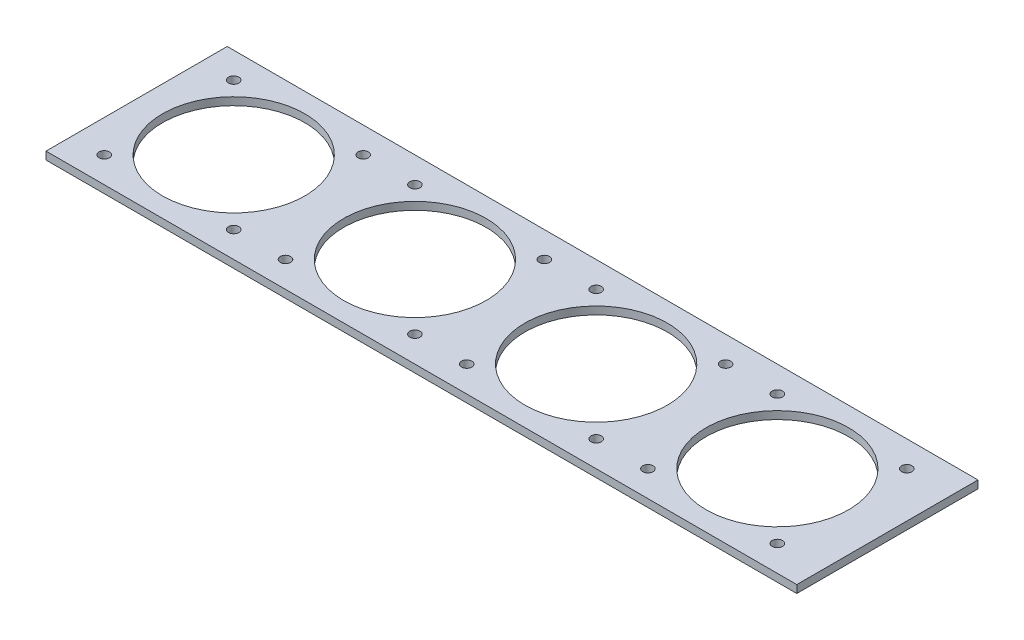
ISO-10303-21;
HEADER;
FILE_DESCRIPTION(('STEP AP214'),'2;1');
FILE_NAME('part.step','',(''),(''),'','','');
FILE_SCHEMA(('AUTOMOTIVE_DESIGN { 1 0 10303 214 1 1 1 1 }'));
ENDSEC;
DATA;
#1=APPLICATION_CONTEXT('core data for automotive mechanical design processes');
#2=APPLICATION_PROTOCOL_DEFINITION('international standard','automotive_design',2000,#1);
#3=PRODUCT_CONTEXT('',#1,'mechanical');
#4=PRODUCT('Part','Part','',(#3));
#5=PRODUCT_RELATED_PRODUCT_CATEGORY('part','',(#4));
#6=PRODUCT_DEFINITION_FORMATION('','',#4);
#7=PRODUCT_DEFINITION_CONTEXT('part definition',#1,'design');
#8=PRODUCT_DEFINITION('design','',#6,#7);
#9=PRODUCT_DEFINITION_SHAPE('','',#8);
#10=(LENGTH_UNIT() NAMED_UNIT(*) SI_UNIT(.MILLI.,.METRE.));
#11=(NAMED_UNIT(*) PLANE_ANGLE_UNIT() SI_UNIT($,.RADIAN.));
#12=(NAMED_UNIT(*) SI_UNIT($,.STERADIAN.) SOLID_ANGLE_UNIT());
#13=UNCERTAINTY_MEASURE_WITH_UNIT(LENGTH_MEASURE(1.E-05),#10,'distance_accuracy_value','');
#14=(GEOMETRIC_REPRESENTATION_CONTEXT(3) GLOBAL_UNCERTAINTY_ASSIGNED_CONTEXT((#13)) GLOBAL_UNIT_ASSIGNED_CONTEXT((#10,
#11,#12)) REPRESENTATION_CONTEXT('',''));
#15=CARTESIAN_POINT('',(0.,0.,0.));
#16=DIRECTION('',(0.,0.,1.));
#17=DIRECTION('',(1.,0.,0.));
#18=AXIS2_PLACEMENT_3D('',#15,#16,#17);
#19=CARTESIAN_POINT('',(0.,3.,0.));
#20=DIRECTION('',(0.,-1.,0.));
#21=DIRECTION('',(0.,0.,-1.));
#22=AXIS2_PLACEMENT_3D('',#19,#20,#21);
#23=PLANE('',#22);
#24=DIRECTION('',(0.,0.,1.));
#25=VECTOR('',#24,1.);
#26=CARTESIAN_POINT('',(0.,3.,0.));
#27=LINE('',#26,#25);
#28=CARTESIAN_POINT('',(0.,3.,-70.));
#29=VERTEX_POINT('',#28);
#30=CARTESIAN_POINT('',(0.,3.,0.));
#31=VERTEX_POINT('',#30);
#32=EDGE_CURVE('E87',#29,#31,#27,.T.);
#33=ORIENTED_EDGE('',*,*,#32,.T.);
#34=DIRECTION('',(1.,0.,0.));
#35=VECTOR('',#34,1.);
#36=CARTESIAN_POINT('',(0.,3.,0.));
#37=LINE('',#36,#35);
#38=CARTESIAN_POINT('',(290.,3.,0.));
#39=VERTEX_POINT('',#38);
#40=EDGE_CURVE('E82',#31,#39,#37,.T.);
#41=ORIENTED_EDGE('',*,*,#40,.T.);
#42=DIRECTION('',(0.,0.,-1.));
#43=VECTOR('',#42,1.);
#44=CARTESIAN_POINT('',(290.,3.,0.));
#45=LINE('',#44,#43);
#46=CARTESIAN_POINT('',(290.,3.,-70.));
#47=VERTEX_POINT('',#46);
#48=EDGE_CURVE('E85',#39,#47,#45,.T.);
#49=ORIENTED_EDGE('',*,*,#48,.T.);
#50=DIRECTION('',(-1.,0.,0.));
#51=VECTOR('',#50,1.);
#52=CARTESIAN_POINT('',(0.,3.,-70.));
#53=LINE('',#52,#51);
#54=EDGE_CURVE('E52',#47,#29,#53,.T.);
#55=ORIENTED_EDGE('',*,*,#54,.T.);
#56=EDGE_LOOP('',(#33,#41,#49,#55));
#57=FACE_BOUND('',#56,.T.);
#58=CARTESIAN_POINT('',(37.5,3.,-35.));
#59=DIRECTION('',(0.,1.,0.));
#60=DIRECTION('',(0.,0.,1.));
#61=AXIS2_PLACEMENT_3D('',#58,#59,#60);
#62=CIRCLE('',#61,27.5);
#63=CARTESIAN_POINT('',(37.5,3.,-7.5));
#64=VERTEX_POINT('',#63);
#65=EDGE_CURVE('E102',#64,#64,#62,.T.);
#66=ORIENTED_EDGE('',*,*,#65,.F.);
#67=EDGE_LOOP('',(#66));
#68=FACE_BOUND('',#67,.T.);
#69=CARTESIAN_POINT('',(12.5,3.,-60.));
#70=DIRECTION('',(0.,1.,0.));
#71=DIRECTION('',(0.,0.,1.));
#72=AXIS2_PLACEMENT_3D('',#69,#70,#71);
#73=CIRCLE('',#72,2.);
#74=CARTESIAN_POINT('',(12.5,3.,-58.));
#75=VERTEX_POINT('',#74);
#76=EDGE_CURVE('E117',#75,#75,#73,.T.);
#77=ORIENTED_EDGE('',*,*,#76,.F.);
#78=EDGE_LOOP('',(#77));
#79=FACE_BOUND('',#78,.T.);
#80=CARTESIAN_POINT('',(62.5,3.,-60.));
#81=DIRECTION('',(0.,1.,0.));
#82=DIRECTION('',(0.,0.,1.));
#83=AXIS2_PLACEMENT_3D('',#80,#81,#82);
#84=CIRCLE('',#83,2.);
#85=CARTESIAN_POINT('',(62.5,3.,-58.));
#86=VERTEX_POINT('',#85);
#87=EDGE_CURVE('E123',#86,#86,#84,.T.);
#88=ORIENTED_EDGE('',*,*,#87,.F.);
#89=EDGE_LOOP('',(#88));
#90=FACE_BOUND('',#89,.T.);
#91=CARTESIAN_POINT('',(62.5,3.,-10.));
#92=DIRECTION('',(0.,1.,0.));
#93=DIRECTION('',(0.,0.,1.));
#94=AXIS2_PLACEMENT_3D('',#91,#92,#93);
#95=CIRCLE('',#94,2.);
#96=CARTESIAN_POINT('',(62.5,3.,-8.00000000000001));
#97=VERTEX_POINT('',#96);
#98=EDGE_CURVE('E129',#97,#97,#95,.T.);
#99=ORIENTED_EDGE('',*,*,#98,.F.);
#100=EDGE_LOOP('',(#99));
#101=FACE_BOUND('',#100,.T.);
#102=CARTESIAN_POINT('',(12.5,3.,-10.));
#103=DIRECTION('',(0.,1.,0.));
#104=DIRECTION('',(0.,0.,1.));
#105=AXIS2_PLACEMENT_3D('',#102,#103,#104);
#106=CIRCLE('',#105,2.);
#107=CARTESIAN_POINT('',(12.5,3.,-8.));
#108=VERTEX_POINT('',#107);
#109=EDGE_CURVE('E135',#108,#108,#106,.T.);
#110=ORIENTED_EDGE('',*,*,#109,.F.);
#111=EDGE_LOOP('',(#110));
#112=FACE_BOUND('',#111,.T.);
#113=CARTESIAN_POINT('',(107.5,3.,-35.));
#114=DIRECTION('',(0.,1.,0.));
#115=DIRECTION('',(0.,0.,1.));
#116=AXIS2_PLACEMENT_3D('',#113,#114,#115);
#117=CIRCLE('',#116,27.5);
#118=CARTESIAN_POINT('',(107.5,3.,-7.5));
#119=VERTEX_POINT('',#118);
#120=EDGE_CURVE('E141',#119,#119,#117,.T.);
#121=ORIENTED_EDGE('',*,*,#120,.F.);
#122=EDGE_LOOP('',(#121));
#123=FACE_BOUND('',#122,.T.);
#124=CARTESIAN_POINT('',(82.5,3.,-60.));
#125=DIRECTION('',(0.,1.,0.));
#126=DIRECTION('',(0.,0.,1.));
#127=AXIS2_PLACEMENT_3D('',#124,#125,#126);
#128=CIRCLE('',#127,2.);
#129=CARTESIAN_POINT('',(82.5,3.,-58.));
#130=VERTEX_POINT('',#129);
#131=EDGE_CURVE('E147',#130,#130,#128,.T.);
#132=ORIENTED_EDGE('',*,*,#131,.F.);
#133=EDGE_LOOP('',(#132));
#134=FACE_BOUND('',#133,.T.);
#135=CARTESIAN_POINT('',(132.5,3.,-60.));
#136=DIRECTION('',(0.,1.,0.));
#137=DIRECTION('',(0.,0.,1.));
#138=AXIS2_PLACEMENT_3D('',#135,#136,#137);
#139=CIRCLE('',#138,2.);
#140=CARTESIAN_POINT('',(132.5,3.,-58.));
#141=VERTEX_POINT('',#140);
#142=EDGE_CURVE('E153',#141,#141,#139,.T.);
#143=ORIENTED_EDGE('',*,*,#142,.F.);
#144=EDGE_LOOP('',(#143));
#145=FACE_BOUND('',#144,.T.);
#146=CARTESIAN_POINT('',(132.5,3.,-10.));
#147=DIRECTION('',(0.,1.,0.));
#148=DIRECTION('',(0.,0.,1.));
#149=AXIS2_PLACEMENT_3D('',#146,#147,#148);
#150=CIRCLE('',#149,2.);
#151=CARTESIAN_POINT('',(132.5,3.,-8.00000000000001));
#152=VERTEX_POINT('',#151);
#153=EDGE_CURVE('E159',#152,#152,#150,.T.);
#154=ORIENTED_EDGE('',*,*,#153,.F.);
#155=EDGE_LOOP('',(#154));
#156=FACE_BOUND('',#155,.T.);
#157=CARTESIAN_POINT('',(82.5,3.,-10.));
#158=DIRECTION('',(0.,1.,0.));
#159=DIRECTION('',(0.,0.,1.));
#160=AXIS2_PLACEMENT_3D('',#157,#158,#159);
#161=CIRCLE('',#160,2.);
#162=CARTESIAN_POINT('',(82.5,3.,-8.00000000000001));
#163=VERTEX_POINT('',#162);
#164=EDGE_CURVE('E165',#163,#163,#161,.T.);
#165=ORIENTED_EDGE('',*,*,#164,.F.);
#166=EDGE_LOOP('',(#165));
#167=FACE_BOUND('',#166,.T.);
#168=CARTESIAN_POINT('',(177.5,3.,-35.));
#169=DIRECTION('',(0.,1.,0.));
#170=DIRECTION('',(0.,0.,1.));
#171=AXIS2_PLACEMENT_3D('',#168,#169,#170);
#172=CIRCLE('',#171,27.5);
#173=CARTESIAN_POINT('',(177.5,3.,-7.5));
#174=VERTEX_POINT('',#173);
#175=EDGE_CURVE('E171',#174,#174,#172,.T.);
#176=ORIENTED_EDGE('',*,*,#175,.F.);
#177=EDGE_LOOP('',(#176));
#178=FACE_BOUND('',#177,.T.);
#179=CARTESIAN_POINT('',(152.5,3.,-60.));
#180=DIRECTION('',(0.,1.,0.));
#181=DIRECTION('',(0.,0.,1.));
#182=AXIS2_PLACEMENT_3D('',#179,#180,#181);
#183=CIRCLE('',#182,2.);
#184=CARTESIAN_POINT('',(152.5,3.,-58.));
#185=VERTEX_POINT('',#184);
#186=EDGE_CURVE('E177',#185,#185,#183,.T.);
#187=ORIENTED_EDGE('',*,*,#186,.F.);
#188=EDGE_LOOP('',(#187));
#189=FACE_BOUND('',#188,.T.);
#190=CARTESIAN_POINT('',(202.5,3.,-60.));
#191=DIRECTION('',(0.,1.,0.));
#192=DIRECTION('',(0.,0.,1.));
#193=AXIS2_PLACEMENT_3D('',#190,#191,#192);
#194=CIRCLE('',#193,2.);
#195=CARTESIAN_POINT('',(202.5,3.,-58.));
#196=VERTEX_POINT('',#195);
#197=EDGE_CURVE('E183',#196,#196,#194,.T.);
#198=ORIENTED_EDGE('',*,*,#197,.F.);
#199=EDGE_LOOP('',(#198));
#200=FACE_BOUND('',#199,.T.);
#201=CARTESIAN_POINT('',(202.5,3.,-10.));
#202=DIRECTION('',(0.,1.,0.));
#203=DIRECTION('',(0.,0.,1.));
#204=AXIS2_PLACEMENT_3D('',#201,#202,#203);
#205=CIRCLE('',#204,2.);
#206=CARTESIAN_POINT('',(202.5,3.,-8.00000000000001));
#207=VERTEX_POINT('',#206);
#208=EDGE_CURVE('E189',#207,#207,#205,.T.);
#209=ORIENTED_EDGE('',*,*,#208,.F.);
#210=EDGE_LOOP('',(#209));
#211=FACE_BOUND('',#210,.T.);
#212=CARTESIAN_POINT('',(152.5,3.,-10.));
#213=DIRECTION('',(0.,1.,0.));
#214=DIRECTION('',(0.,0.,1.));
#215=AXIS2_PLACEMENT_3D('',#212,#213,#214);
#216=CIRCLE('',#215,2.);
#217=CARTESIAN_POINT('',(152.5,3.,-8.00000000000001));
#218=VERTEX_POINT('',#217);
#219=EDGE_CURVE('E195',#218,#218,#216,.T.);
#220=ORIENTED_EDGE('',*,*,#219,.F.);
#221=EDGE_LOOP('',(#220));
#222=FACE_BOUND('',#221,.T.);
#223=CARTESIAN_POINT('',(247.5,3.,-35.));
#224=DIRECTION('',(0.,1.,0.));
#225=DIRECTION('',(0.,0.,1.));
#226=AXIS2_PLACEMENT_3D('',#223,#224,#225);
#227=CIRCLE('',#226,27.5);
#228=CARTESIAN_POINT('',(247.5,3.,-7.5));
#229=VERTEX_POINT('',#228);
#230=EDGE_CURVE('E201',#229,#229,#227,.T.);
#231=ORIENTED_EDGE('',*,*,#230,.F.);
#232=EDGE_LOOP('',(#231));
#233=FACE_BOUND('',#232,.T.);
#234=CARTESIAN_POINT('',(222.5,3.,-60.));
#235=DIRECTION('',(0.,1.,0.));
#236=DIRECTION('',(0.,0.,1.));
#237=AXIS2_PLACEMENT_3D('',#234,#235,#236);
#238=CIRCLE('',#237,2.);
#239=CARTESIAN_POINT('',(222.5,3.,-58.));
#240=VERTEX_POINT('',#239);
#241=EDGE_CURVE('E207',#240,#240,#238,.T.);
#242=ORIENTED_EDGE('',*,*,#241,.F.);
#243=EDGE_LOOP('',(#242));
#244=FACE_BOUND('',#243,.T.);
#245=CARTESIAN_POINT('',(272.5,3.,-60.));
#246=DIRECTION('',(0.,1.,0.));
#247=DIRECTION('',(0.,0.,1.));
#248=AXIS2_PLACEMENT_3D('',#245,#246,#247);
#249=CIRCLE('',#248,2.);
#250=CARTESIAN_POINT('',(272.5,3.,-58.));
#251=VERTEX_POINT('',#250);
#252=EDGE_CURVE('E213',#251,#251,#249,.T.);
#253=ORIENTED_EDGE('',*,*,#252,.F.);
#254=EDGE_LOOP('',(#253));
#255=FACE_BOUND('',#254,.T.);
#256=CARTESIAN_POINT('',(272.5,3.,-10.));
#257=DIRECTION('',(0.,1.,0.));
#258=DIRECTION('',(0.,0.,1.));
#259=AXIS2_PLACEMENT_3D('',#256,#257,#258);
#260=CIRCLE('',#259,2.);
#261=CARTESIAN_POINT('',(272.5,3.,-8.00000000000001));
#262=VERTEX_POINT('',#261);
#263=EDGE_CURVE('E219',#262,#262,#260,.T.);
#264=ORIENTED_EDGE('',*,*,#263,.F.);
#265=EDGE_LOOP('',(#264));
#266=FACE_BOUND('',#265,.T.);
#267=CARTESIAN_POINT('',(222.5,3.,-10.));
#268=DIRECTION('',(0.,1.,0.));
#269=DIRECTION('',(0.,0.,1.));
#270=AXIS2_PLACEMENT_3D('',#267,#268,#269);
#271=CIRCLE('',#270,2.);
#272=CARTESIAN_POINT('',(222.5,3.,-8.00000000000001));
#273=VERTEX_POINT('',#272);
#274=EDGE_CURVE('E225',#273,#273,#271,.T.);
#275=ORIENTED_EDGE('',*,*,#274,.F.);
#276=EDGE_LOOP('',(#275));
#277=FACE_BOUND('',#276,.T.);
#278=ADVANCED_FACE('F35',(#57,#68,#79,#90,#101,#112,#123,#134,#145,#156,#167,#178,#189,#200,
#211,#222,#233,#244,#255,#266,#277),#23,.F.);
#279=CARTESIAN_POINT('',(0.,0.,0.));
#280=DIRECTION('',(0.,-1.,0.));
#281=DIRECTION('',(0.,0.,-1.));
#282=AXIS2_PLACEMENT_3D('',#279,#280,#281);
#283=PLANE('',#282);
#284=CARTESIAN_POINT('',(272.5,0.,-10.));
#285=DIRECTION('',(0.,1.,0.));
#286=DIRECTION('',(0.,0.,1.));
#287=AXIS2_PLACEMENT_3D('',#284,#285,#286);
#288=CIRCLE('',#287,2.);
#289=CARTESIAN_POINT('',(272.5,0.,-8.00000000000001));
#290=VERTEX_POINT('',#289);
#291=EDGE_CURVE('E222',#290,#290,#288,.T.);
#292=ORIENTED_EDGE('',*,*,#291,.T.);
#293=EDGE_LOOP('',(#292));
#294=FACE_BOUND('',#293,.T.);
#295=CARTESIAN_POINT('',(222.5,0.,-60.));
#296=DIRECTION('',(0.,1.,0.));
#297=DIRECTION('',(0.,0.,1.));
#298=AXIS2_PLACEMENT_3D('',#295,#296,#297);
#299=CIRCLE('',#298,2.);
#300=CARTESIAN_POINT('',(222.5,0.,-58.));
#301=VERTEX_POINT('',#300);
#302=EDGE_CURVE('E210',#301,#301,#299,.T.);
#303=ORIENTED_EDGE('',*,*,#302,.T.);
#304=EDGE_LOOP('',(#303));
#305=FACE_BOUND('',#304,.T.);
#306=CARTESIAN_POINT('',(152.5,0.,-10.));
#307=DIRECTION('',(0.,1.,0.));
#308=DIRECTION('',(0.,0.,1.));
#309=AXIS2_PLACEMENT_3D('',#306,#307,#308);
#310=CIRCLE('',#309,2.);
#311=CARTESIAN_POINT('',(152.5,0.,-8.00000000000001));
#312=VERTEX_POINT('',#311);
#313=EDGE_CURVE('E198',#312,#312,#310,.T.);
#314=ORIENTED_EDGE('',*,*,#313,.T.);
#315=EDGE_LOOP('',(#314));
#316=FACE_BOUND('',#315,.T.);
#317=CARTESIAN_POINT('',(202.5,0.,-60.));
#318=DIRECTION('',(0.,1.,0.));
#319=DIRECTION('',(0.,0.,1.));
#320=AXIS2_PLACEMENT_3D('',#317,#318,#319);
#321=CIRCLE('',#320,2.);
#322=CARTESIAN_POINT('',(202.5,0.,-58.));
#323=VERTEX_POINT('',#322);
#324=EDGE_CURVE('E186',#323,#323,#321,.T.);
#325=ORIENTED_EDGE('',*,*,#324,.T.);
#326=EDGE_LOOP('',(#325));
#327=FACE_BOUND('',#326,.T.);
#328=CARTESIAN_POINT('',(177.5,0.,-35.));
#329=DIRECTION('',(0.,1.,0.));
#330=DIRECTION('',(0.,0.,1.));
#331=AXIS2_PLACEMENT_3D('',#328,#329,#330);
#332=CIRCLE('',#331,27.5);
#333=CARTESIAN_POINT('',(177.5,0.,-7.5));
#334=VERTEX_POINT('',#333);
#335=EDGE_CURVE('E174',#334,#334,#332,.T.);
#336=ORIENTED_EDGE('',*,*,#335,.T.);
#337=EDGE_LOOP('',(#336));
#338=FACE_BOUND('',#337,.T.);
#339=CARTESIAN_POINT('',(132.5,0.,-10.));
#340=DIRECTION('',(0.,1.,0.));
#341=DIRECTION('',(0.,0.,1.));
#342=AXIS2_PLACEMENT_3D('',#339,#340,#341);
#343=CIRCLE('',#342,2.);
#344=CARTESIAN_POINT('',(132.5,0.,-8.00000000000001));
#345=VERTEX_POINT('',#344);
#346=EDGE_CURVE('E162',#345,#345,#343,.T.);
#347=ORIENTED_EDGE('',*,*,#346,.T.);
#348=EDGE_LOOP('',(#347));
#349=FACE_BOUND('',#348,.T.);
#350=CARTESIAN_POINT('',(82.5,0.,-60.));
#351=DIRECTION('',(0.,1.,0.));
#352=DIRECTION('',(0.,0.,1.));
#353=AXIS2_PLACEMENT_3D('',#350,#351,#352);
#354=CIRCLE('',#353,2.);
#355=CARTESIAN_POINT('',(82.5,0.,-58.));
#356=VERTEX_POINT('',#355);
#357=EDGE_CURVE('E150',#356,#356,#354,.T.);
#358=ORIENTED_EDGE('',*,*,#357,.T.);
#359=EDGE_LOOP('',(#358));
#360=FACE_BOUND('',#359,.T.);
#361=CARTESIAN_POINT('',(12.5,0.,-10.));
#362=DIRECTION('',(0.,1.,0.));
#363=DIRECTION('',(0.,0.,1.));
#364=AXIS2_PLACEMENT_3D('',#361,#362,#363);
#365=CIRCLE('',#364,2.);
#366=CARTESIAN_POINT('',(12.5,0.,-8.));
#367=VERTEX_POINT('',#366);
#368=EDGE_CURVE('E138',#367,#367,#365,.T.);
#369=ORIENTED_EDGE('',*,*,#368,.T.);
#370=EDGE_LOOP('',(#369));
#371=FACE_BOUND('',#370,.T.);
#372=CARTESIAN_POINT('',(62.5,0.,-60.));
#373=DIRECTION('',(0.,1.,0.));
#374=DIRECTION('',(0.,0.,1.));
#375=AXIS2_PLACEMENT_3D('',#372,#373,#374);
#376=CIRCLE('',#375,2.);
#377=CARTESIAN_POINT('',(62.5,0.,-58.));
#378=VERTEX_POINT('',#377);
#379=EDGE_CURVE('E126',#378,#378,#376,.T.);
#380=ORIENTED_EDGE('',*,*,#379,.T.);
#381=EDGE_LOOP('',(#380));
#382=FACE_BOUND('',#381,.T.);
#383=CARTESIAN_POINT('',(37.5,0.,-35.));
#384=DIRECTION('',(0.,1.,0.));
#385=DIRECTION('',(0.,0.,1.));
#386=AXIS2_PLACEMENT_3D('',#383,#384,#385);
#387=CIRCLE('',#386,27.5);
#388=CARTESIAN_POINT('',(37.5,0.,-7.5));
#389=VERTEX_POINT('',#388);
#390=EDGE_CURVE('E114',#389,#389,#387,.T.);
#391=ORIENTED_EDGE('',*,*,#390,.T.);
#392=EDGE_LOOP('',(#391));
#393=FACE_BOUND('',#392,.T.);
#394=DIRECTION('',(0.,0.,1.));
#395=VECTOR('',#394,1.);
#396=CARTESIAN_POINT('',(0.,0.,0.));
#397=LINE('',#396,#395);
#398=CARTESIAN_POINT('',(0.,0.,-70.));
#399=VERTEX_POINT('',#398);
#400=CARTESIAN_POINT('',(0.,0.,0.));
#401=VERTEX_POINT('',#400);
#402=EDGE_CURVE('E99',#399,#401,#397,.T.);
#403=ORIENTED_EDGE('',*,*,#402,.F.);
#404=DIRECTION('',(-1.,0.,0.));
#405=VECTOR('',#404,1.);
#406=CARTESIAN_POINT('',(0.,0.,-70.));
#407=LINE('',#406,#405);
#408=CARTESIAN_POINT('',(290.,0.,-70.));
#409=VERTEX_POINT('',#408);
#410=EDGE_CURVE('E75',#409,#399,#407,.T.);
#411=ORIENTED_EDGE('',*,*,#410,.F.);
#412=DIRECTION('',(0.,0.,-1.));
#413=VECTOR('',#412,1.);
#414=CARTESIAN_POINT('',(290.,0.,0.));
#415=LINE('',#414,#413);
#416=CARTESIAN_POINT('',(290.,0.,0.));
#417=VERTEX_POINT('',#416);
#418=EDGE_CURVE('E69',#417,#409,#415,.T.);
#419=ORIENTED_EDGE('',*,*,#418,.F.);
#420=DIRECTION('',(1.,0.,0.));
#421=VECTOR('',#420,1.);
#422=CARTESIAN_POINT('',(0.,0.,0.));
#423=LINE('',#422,#421);
#424=EDGE_CURVE('E91',#401,#417,#423,.T.);
#425=ORIENTED_EDGE('',*,*,#424,.F.);
#426=EDGE_LOOP('',(#403,#411,#419,#425));
#427=FACE_BOUND('',#426,.T.);
#428=CARTESIAN_POINT('',(12.5,0.,-60.));
#429=DIRECTION('',(0.,1.,0.));
#430=DIRECTION('',(0.,0.,1.));
#431=AXIS2_PLACEMENT_3D('',#428,#429,#430);
#432=CIRCLE('',#431,2.);
#433=CARTESIAN_POINT('',(12.5,0.,-58.));
#434=VERTEX_POINT('',#433);
#435=EDGE_CURVE('E120',#434,#434,#432,.T.);
#436=ORIENTED_EDGE('',*,*,#435,.T.);
#437=EDGE_LOOP('',(#436));
#438=FACE_BOUND('',#437,.T.);
#439=CARTESIAN_POINT('',(62.5,0.,-10.));
#440=DIRECTION('',(0.,1.,0.));
#441=DIRECTION('',(0.,0.,1.));
#442=AXIS2_PLACEMENT_3D('',#439,#440,#441);
#443=CIRCLE('',#442,2.);
#444=CARTESIAN_POINT('',(62.5,0.,-8.00000000000001));
#445=VERTEX_POINT('',#444);
#446=EDGE_CURVE('E132',#445,#445,#443,.T.);
#447=ORIENTED_EDGE('',*,*,#446,.T.);
#448=EDGE_LOOP('',(#447));
#449=FACE_BOUND('',#448,.T.);
#450=CARTESIAN_POINT('',(107.5,0.,-35.));
#451=DIRECTION('',(0.,1.,0.));
#452=DIRECTION('',(0.,0.,1.));
#453=AXIS2_PLACEMENT_3D('',#450,#451,#452);
#454=CIRCLE('',#453,27.5);
#455=CARTESIAN_POINT('',(107.5,0.,-7.5));
#456=VERTEX_POINT('',#455);
#457=EDGE_CURVE('E144',#456,#456,#454,.T.);
#458=ORIENTED_EDGE('',*,*,#457,.T.);
#459=EDGE_LOOP('',(#458));
#460=FACE_BOUND('',#459,.T.);
#461=CARTESIAN_POINT('',(132.5,0.,-60.));
#462=DIRECTION('',(0.,1.,0.));
#463=DIRECTION('',(0.,0.,1.));
#464=AXIS2_PLACEMENT_3D('',#461,#462,#463);
#465=CIRCLE('',#464,2.);
#466=CARTESIAN_POINT('',(132.5,0.,-58.));
#467=VERTEX_POINT('',#466);
#468=EDGE_CURVE('E156',#467,#467,#465,.T.);
#469=ORIENTED_EDGE('',*,*,#468,.T.);
#470=EDGE_LOOP('',(#469));
#471=FACE_BOUND('',#470,.T.);
#472=CARTESIAN_POINT('',(82.5,0.,-10.));
#473=DIRECTION('',(0.,1.,0.));
#474=DIRECTION('',(0.,0.,1.));
#475=AXIS2_PLACEMENT_3D('',#472,#473,#474);
#476=CIRCLE('',#475,2.);
#477=CARTESIAN_POINT('',(82.5,0.,-8.00000000000001));
#478=VERTEX_POINT('',#477);
#479=EDGE_CURVE('E168',#478,#478,#476,.T.);
#480=ORIENTED_EDGE('',*,*,#479,.T.);
#481=EDGE_LOOP('',(#480));
#482=FACE_BOUND('',#481,.T.);
#483=CARTESIAN_POINT('',(152.5,0.,-60.));
#484=DIRECTION('',(0.,1.,0.));
#485=DIRECTION('',(0.,0.,1.));
#486=AXIS2_PLACEMENT_3D('',#483,#484,#485);
#487=CIRCLE('',#486,2.);
#488=CARTESIAN_POINT('',(152.5,0.,-58.));
#489=VERTEX_POINT('',#488);
#490=EDGE_CURVE('E180',#489,#489,#487,.T.);
#491=ORIENTED_EDGE('',*,*,#490,.T.);
#492=EDGE_LOOP('',(#491));
#493=FACE_BOUND('',#492,.T.);
#494=CARTESIAN_POINT('',(202.5,0.,-10.));
#495=DIRECTION('',(0.,1.,0.));
#496=DIRECTION('',(0.,0.,1.));
#497=AXIS2_PLACEMENT_3D('',#494,#495,#496);
#498=CIRCLE('',#497,2.);
#499=CARTESIAN_POINT('',(202.5,0.,-8.00000000000001));
#500=VERTEX_POINT('',#499);
#501=EDGE_CURVE('E192',#500,#500,#498,.T.);
#502=ORIENTED_EDGE('',*,*,#501,.T.);
#503=EDGE_LOOP('',(#502));
#504=FACE_BOUND('',#503,.T.);
#505=CARTESIAN_POINT('',(247.5,0.,-35.));
#506=DIRECTION('',(0.,1.,0.));
#507=DIRECTION('',(0.,0.,1.));
#508=AXIS2_PLACEMENT_3D('',#505,#506,#507);
#509=CIRCLE('',#508,27.5);
#510=CARTESIAN_POINT('',(247.5,0.,-7.5));
#511=VERTEX_POINT('',#510);
#512=EDGE_CURVE('E204',#511,#511,#509,.T.);
#513=ORIENTED_EDGE('',*,*,#512,.T.);
#514=EDGE_LOOP('',(#513));
#515=FACE_BOUND('',#514,.T.);
#516=CARTESIAN_POINT('',(272.5,0.,-60.));
#517=DIRECTION('',(0.,1.,0.));
#518=DIRECTION('',(0.,0.,1.));
#519=AXIS2_PLACEMENT_3D('',#516,#517,#518);
#520=CIRCLE('',#519,2.);
#521=CARTESIAN_POINT('',(272.5,0.,-58.));
#522=VERTEX_POINT('',#521);
#523=EDGE_CURVE('E216',#522,#522,#520,.T.);
#524=ORIENTED_EDGE('',*,*,#523,.T.);
#525=EDGE_LOOP('',(#524));
#526=FACE_BOUND('',#525,.T.);
#527=CARTESIAN_POINT('',(222.5,0.,-10.));
#528=DIRECTION('',(0.,1.,0.));
#529=DIRECTION('',(0.,0.,1.));
#530=AXIS2_PLACEMENT_3D('',#527,#528,#529);
#531=CIRCLE('',#530,2.);
#532=CARTESIAN_POINT('',(222.5,0.,-8.00000000000001));
#533=VERTEX_POINT('',#532);
#534=EDGE_CURVE('E228',#533,#533,#531,.T.);
#535=ORIENTED_EDGE('',*,*,#534,.T.);
#536=EDGE_LOOP('',(#535));
#537=FACE_BOUND('',#536,.T.);
#538=ADVANCED_FACE('F110',(#294,#305,#316,#327,#338,#349,#360,#371,#382,#393,#427,#438,#449,
#460,#471,#482,#493,#504,#515,#526,#537),#283,.T.);
#539=CARTESIAN_POINT('',(0.,3.,0.));
#540=DIRECTION('',(1.,0.,0.));
#541=DIRECTION('',(0.,0.,-1.));
#542=AXIS2_PLACEMENT_3D('',#539,#540,#541);
#543=PLANE('',#542);
#544=ORIENTED_EDGE('',*,*,#402,.T.);
#545=DIRECTION('',(0.,-1.,0.));
#546=VECTOR('',#545,1.);
#547=CARTESIAN_POINT('',(0.,3.,0.));
#548=LINE('',#547,#546);
#549=EDGE_CURVE('E11',#31,#401,#548,.T.);
#550=ORIENTED_EDGE('',*,*,#549,.F.);
#551=ORIENTED_EDGE('',*,*,#32,.F.);
#552=DIRECTION('',(0.,-1.,0.));
#553=VECTOR('',#552,1.);
#554=CARTESIAN_POINT('',(0.,3.,-70.));
#555=LINE('',#554,#553);
#556=EDGE_CURVE('E95',#29,#399,#555,.T.);
#557=ORIENTED_EDGE('',*,*,#556,.T.);
#558=EDGE_LOOP('',(#544,#550,#551,#557));
#559=FACE_BOUND('',#558,.T.);
#560=ADVANCED_FACE('F37',(#559),#543,.F.);
#561=CARTESIAN_POINT('',(0.,3.,0.));
#562=DIRECTION('',(0.,0.,-1.));
#563=DIRECTION('',(-1.,0.,0.));
#564=AXIS2_PLACEMENT_3D('',#561,#562,#563);
#565=PLANE('',#564);
#566=ORIENTED_EDGE('',*,*,#424,.T.);
#567=DIRECTION('',(0.,-1.,0.));
#568=VECTOR('',#567,1.);
#569=CARTESIAN_POINT('',(290.,3.,0.));
#570=LINE('',#569,#568);
#571=EDGE_CURVE('E44',#39,#417,#570,.T.);
#572=ORIENTED_EDGE('',*,*,#571,.F.);
#573=ORIENTED_EDGE('',*,*,#40,.F.);
#574=ORIENTED_EDGE('',*,*,#549,.T.);
#575=EDGE_LOOP('',(#566,#572,#573,#574));
#576=FACE_BOUND('',#575,.T.);
#577=ADVANCED_FACE('F90',(#576),#565,.F.);
#578=CARTESIAN_POINT('',(290.,3.,0.));
#579=DIRECTION('',(-1.,0.,0.));
#580=DIRECTION('',(0.,0.,1.));
#581=AXIS2_PLACEMENT_3D('',#578,#579,#580);
#582=PLANE('',#581);
#583=ORIENTED_EDGE('',*,*,#418,.T.);
#584=DIRECTION('',(0.,-1.,0.));
#585=VECTOR('',#584,1.);
#586=CARTESIAN_POINT('',(290.,3.,-70.));
#587=LINE('',#586,#585);
#588=EDGE_CURVE('E92',#47,#409,#587,.T.);
#589=ORIENTED_EDGE('',*,*,#588,.F.);
#590=ORIENTED_EDGE('',*,*,#48,.F.);
#591=ORIENTED_EDGE('',*,*,#571,.T.);
#592=EDGE_LOOP('',(#583,#589,#590,#591));
#593=FACE_BOUND('',#592,.T.);
#594=ADVANCED_FACE('F93',(#593),#582,.F.);
#595=CARTESIAN_POINT('',(0.,3.,-70.));
#596=DIRECTION('',(0.,0.,1.));
#597=DIRECTION('',(1.,0.,0.));
#598=AXIS2_PLACEMENT_3D('',#595,#596,#597);
#599=PLANE('',#598);
#600=ORIENTED_EDGE('',*,*,#410,.T.);
#601=ORIENTED_EDGE('',*,*,#556,.F.);
#602=ORIENTED_EDGE('',*,*,#54,.F.);
#603=ORIENTED_EDGE('',*,*,#588,.T.);
#604=EDGE_LOOP('',(#600,#601,#602,#603));
#605=FACE_BOUND('',#604,.T.);
#606=ADVANCED_FACE('F107',(#605),#599,.F.);
#607=CARTESIAN_POINT('',(37.5,3.,-35.));
#608=DIRECTION('',(0.,-1.,0.));
#609=DIRECTION('',(0.,0.,-1.));
#610=AXIS2_PLACEMENT_3D('',#607,#608,#609);
#611=CYLINDRICAL_SURFACE('',#610,27.5);
#612=ORIENTED_EDGE('',*,*,#65,.T.);
#613=EDGE_LOOP('',(#612));
#614=FACE_BOUND('',#613,.T.);
#615=ORIENTED_EDGE('',*,*,#390,.F.);
#616=EDGE_LOOP('',(#615));
#617=FACE_BOUND('',#616,.T.);
#618=ADVANCED_FACE('F245',(#614,#617),#611,.F.);
#619=CARTESIAN_POINT('',(12.5,3.,-60.));
#620=DIRECTION('',(0.,-1.,0.));
#621=DIRECTION('',(0.,0.,-1.));
#622=AXIS2_PLACEMENT_3D('',#619,#620,#621);
#623=CYLINDRICAL_SURFACE('',#622,2.);
#624=ORIENTED_EDGE('',*,*,#76,.T.);
#625=EDGE_LOOP('',(#624));
#626=FACE_BOUND('',#625,.T.);
#627=ORIENTED_EDGE('',*,*,#435,.F.);
#628=EDGE_LOOP('',(#627));
#629=FACE_BOUND('',#628,.T.);
#630=ADVANCED_FACE('F291',(#626,#629),#623,.F.);
#631=CARTESIAN_POINT('',(62.5,3.,-60.));
#632=DIRECTION('',(0.,-1.,0.));
#633=DIRECTION('',(0.,0.,-1.));
#634=AXIS2_PLACEMENT_3D('',#631,#632,#633);
#635=CYLINDRICAL_SURFACE('',#634,2.);
#636=ORIENTED_EDGE('',*,*,#87,.T.);
#637=EDGE_LOOP('',(#636));
#638=FACE_BOUND('',#637,.T.);
#639=ORIENTED_EDGE('',*,*,#379,.F.);
#640=EDGE_LOOP('',(#639));
#641=FACE_BOUND('',#640,.T.);
#642=ADVANCED_FACE('F299',(#638,#641),#635,.F.);
#643=CARTESIAN_POINT('',(62.5,3.,-10.));
#644=DIRECTION('',(0.,-1.,0.));
#645=DIRECTION('',(0.,0.,-1.));
#646=AXIS2_PLACEMENT_3D('',#643,#644,#645);
#647=CYLINDRICAL_SURFACE('',#646,2.);
#648=ORIENTED_EDGE('',*,*,#98,.T.);
#649=EDGE_LOOP('',(#648));
#650=FACE_BOUND('',#649,.T.);
#651=ORIENTED_EDGE('',*,*,#446,.F.);
#652=EDGE_LOOP('',(#651));
#653=FACE_BOUND('',#652,.T.);
#654=ADVANCED_FACE('F307',(#650,#653),#647,.F.);
#655=CARTESIAN_POINT('',(12.5,3.,-10.));
#656=DIRECTION('',(0.,-1.,0.));
#657=DIRECTION('',(0.,0.,-1.));
#658=AXIS2_PLACEMENT_3D('',#655,#656,#657);
#659=CYLINDRICAL_SURFACE('',#658,2.);
#660=ORIENTED_EDGE('',*,*,#109,.T.);
#661=EDGE_LOOP('',(#660));
#662=FACE_BOUND('',#661,.T.);
#663=ORIENTED_EDGE('',*,*,#368,.F.);
#664=EDGE_LOOP('',(#663));
#665=FACE_BOUND('',#664,.T.);
#666=ADVANCED_FACE('F316',(#662,#665),#659,.F.);
#667=CARTESIAN_POINT('',(107.5,3.,-35.));
#668=DIRECTION('',(0.,-1.,0.));
#669=DIRECTION('',(0.,0.,-1.));
#670=AXIS2_PLACEMENT_3D('',#667,#668,#669);
#671=CYLINDRICAL_SURFACE('',#670,27.5);
#672=ORIENTED_EDGE('',*,*,#120,.T.);
#673=EDGE_LOOP('',(#672));
#674=FACE_BOUND('',#673,.T.);
#675=ORIENTED_EDGE('',*,*,#457,.F.);
#676=EDGE_LOOP('',(#675));
#677=FACE_BOUND('',#676,.T.);
#678=ADVANCED_FACE('F325',(#674,#677),#671,.F.);
#679=CARTESIAN_POINT('',(82.5,3.,-60.));
#680=DIRECTION('',(0.,-1.,0.));
#681=DIRECTION('',(0.,0.,-1.));
#682=AXIS2_PLACEMENT_3D('',#679,#680,#681);
#683=CYLINDRICAL_SURFACE('',#682,2.);
#684=ORIENTED_EDGE('',*,*,#131,.T.);
#685=EDGE_LOOP('',(#684));
#686=FACE_BOUND('',#685,.T.);
#687=ORIENTED_EDGE('',*,*,#357,.F.);
#688=EDGE_LOOP('',(#687));
#689=FACE_BOUND('',#688,.T.);
#690=ADVANCED_FACE('F334',(#686,#689),#683,.F.);
#691=CARTESIAN_POINT('',(132.5,3.,-60.));
#692=DIRECTION('',(0.,-1.,0.));
#693=DIRECTION('',(0.,0.,-1.));
#694=AXIS2_PLACEMENT_3D('',#691,#692,#693);
#695=CYLINDRICAL_SURFACE('',#694,2.);
#696=ORIENTED_EDGE('',*,*,#142,.T.);
#697=EDGE_LOOP('',(#696));
#698=FACE_BOUND('',#697,.T.);
#699=ORIENTED_EDGE('',*,*,#468,.F.);
#700=EDGE_LOOP('',(#699));
#701=FACE_BOUND('',#700,.T.);
#702=ADVANCED_FACE('F343',(#698,#701),#695,.F.);
#703=CARTESIAN_POINT('',(132.5,3.,-10.));
#704=DIRECTION('',(0.,-1.,0.));
#705=DIRECTION('',(0.,0.,-1.));
#706=AXIS2_PLACEMENT_3D('',#703,#704,#705);
#707=CYLINDRICAL_SURFACE('',#706,2.);
#708=ORIENTED_EDGE('',*,*,#153,.T.);
#709=EDGE_LOOP('',(#708));
#710=FACE_BOUND('',#709,.T.);
#711=ORIENTED_EDGE('',*,*,#346,.F.);
#712=EDGE_LOOP('',(#711));
#713=FACE_BOUND('',#712,.T.);
#714=ADVANCED_FACE('F352',(#710,#713),#707,.F.);
#715=CARTESIAN_POINT('',(82.5,3.,-10.));
#716=DIRECTION('',(0.,-1.,0.));
#717=DIRECTION('',(0.,0.,-1.));
#718=AXIS2_PLACEMENT_3D('',#715,#716,#717);
#719=CYLINDRICAL_SURFACE('',#718,2.);
#720=ORIENTED_EDGE('',*,*,#164,.T.);
#721=EDGE_LOOP('',(#720));
#722=FACE_BOUND('',#721,.T.);
#723=ORIENTED_EDGE('',*,*,#479,.F.);
#724=EDGE_LOOP('',(#723));
#725=FACE_BOUND('',#724,.T.);
#726=ADVANCED_FACE('F361',(#722,#725),#719,.F.);
#727=CARTESIAN_POINT('',(177.5,3.,-35.));
#728=DIRECTION('',(0.,-1.,0.));
#729=DIRECTION('',(0.,0.,-1.));
#730=AXIS2_PLACEMENT_3D('',#727,#728,#729);
#731=CYLINDRICAL_SURFACE('',#730,27.5);
#732=ORIENTED_EDGE('',*,*,#175,.T.);
#733=EDGE_LOOP('',(#732));
#734=FACE_BOUND('',#733,.T.);
#735=ORIENTED_EDGE('',*,*,#335,.F.);
#736=EDGE_LOOP('',(#735));
#737=FACE_BOUND('',#736,.T.);
#738=ADVANCED_FACE('F370',(#734,#737),#731,.F.);
#739=CARTESIAN_POINT('',(152.5,3.,-60.));
#740=DIRECTION('',(0.,-1.,0.));
#741=DIRECTION('',(0.,0.,-1.));
#742=AXIS2_PLACEMENT_3D('',#739,#740,#741);
#743=CYLINDRICAL_SURFACE('',#742,2.);
#744=ORIENTED_EDGE('',*,*,#186,.T.);
#745=EDGE_LOOP('',(#744));
#746=FACE_BOUND('',#745,.T.);
#747=ORIENTED_EDGE('',*,*,#490,.F.);
#748=EDGE_LOOP('',(#747));
#749=FACE_BOUND('',#748,.T.);
#750=ADVANCED_FACE('F379',(#746,#749),#743,.F.);
#751=CARTESIAN_POINT('',(202.5,3.,-60.));
#752=DIRECTION('',(0.,-1.,0.));
#753=DIRECTION('',(0.,0.,-1.));
#754=AXIS2_PLACEMENT_3D('',#751,#752,#753);
#755=CYLINDRICAL_SURFACE('',#754,2.);
#756=ORIENTED_EDGE('',*,*,#197,.T.);
#757=EDGE_LOOP('',(#756));
#758=FACE_BOUND('',#757,.T.);
#759=ORIENTED_EDGE('',*,*,#324,.F.);
#760=EDGE_LOOP('',(#759));
#761=FACE_BOUND('',#760,.T.);
#762=ADVANCED_FACE('F388',(#758,#761),#755,.F.);
#763=CARTESIAN_POINT('',(202.5,3.,-10.));
#764=DIRECTION('',(0.,-1.,0.));
#765=DIRECTION('',(0.,0.,-1.));
#766=AXIS2_PLACEMENT_3D('',#763,#764,#765);
#767=CYLINDRICAL_SURFACE('',#766,2.);
#768=ORIENTED_EDGE('',*,*,#208,.T.);
#769=EDGE_LOOP('',(#768));
#770=FACE_BOUND('',#769,.T.);
#771=ORIENTED_EDGE('',*,*,#501,.F.);
#772=EDGE_LOOP('',(#771));
#773=FACE_BOUND('',#772,.T.);
#774=ADVANCED_FACE('F397',(#770,#773),#767,.F.);
#775=CARTESIAN_POINT('',(152.5,3.,-10.));
#776=DIRECTION('',(0.,-1.,0.));
#777=DIRECTION('',(0.,0.,-1.));
#778=AXIS2_PLACEMENT_3D('',#775,#776,#777);
#779=CYLINDRICAL_SURFACE('',#778,2.);
#780=ORIENTED_EDGE('',*,*,#219,.T.);
#781=EDGE_LOOP('',(#780));
#782=FACE_BOUND('',#781,.T.);
#783=ORIENTED_EDGE('',*,*,#313,.F.);
#784=EDGE_LOOP('',(#783));
#785=FACE_BOUND('',#784,.T.);
#786=ADVANCED_FACE('F406',(#782,#785),#779,.F.);
#787=CARTESIAN_POINT('',(247.5,3.,-35.));
#788=DIRECTION('',(0.,-1.,0.));
#789=DIRECTION('',(0.,0.,-1.));
#790=AXIS2_PLACEMENT_3D('',#787,#788,#789);
#791=CYLINDRICAL_SURFACE('',#790,27.5);
#792=ORIENTED_EDGE('',*,*,#230,.T.);
#793=EDGE_LOOP('',(#792));
#794=FACE_BOUND('',#793,.T.);
#795=ORIENTED_EDGE('',*,*,#512,.F.);
#796=EDGE_LOOP('',(#795));
#797=FACE_BOUND('',#796,.T.);
#798=ADVANCED_FACE('F415',(#794,#797),#791,.F.);
#799=CARTESIAN_POINT('',(222.5,3.,-60.));
#800=DIRECTION('',(0.,-1.,0.));
#801=DIRECTION('',(0.,0.,-1.));
#802=AXIS2_PLACEMENT_3D('',#799,#800,#801);
#803=CYLINDRICAL_SURFACE('',#802,2.);
#804=ORIENTED_EDGE('',*,*,#241,.T.);
#805=EDGE_LOOP('',(#804));
#806=FACE_BOUND('',#805,.T.);
#807=ORIENTED_EDGE('',*,*,#302,.F.);
#808=EDGE_LOOP('',(#807));
#809=FACE_BOUND('',#808,.T.);
#810=ADVANCED_FACE('F424',(#806,#809),#803,.F.);
#811=CARTESIAN_POINT('',(272.5,3.,-60.));
#812=DIRECTION('',(0.,-1.,0.));
#813=DIRECTION('',(0.,0.,-1.));
#814=AXIS2_PLACEMENT_3D('',#811,#812,#813);
#815=CYLINDRICAL_SURFACE('',#814,2.);
#816=ORIENTED_EDGE('',*,*,#252,.T.);
#817=EDGE_LOOP('',(#816));
#818=FACE_BOUND('',#817,.T.);
#819=ORIENTED_EDGE('',*,*,#523,.F.);
#820=EDGE_LOOP('',(#819));
#821=FACE_BOUND('',#820,.T.);
#822=ADVANCED_FACE('F433',(#818,#821),#815,.F.);
#823=CARTESIAN_POINT('',(272.5,3.,-10.));
#824=DIRECTION('',(0.,-1.,0.));
#825=DIRECTION('',(0.,0.,-1.));
#826=AXIS2_PLACEMENT_3D('',#823,#824,#825);
#827=CYLINDRICAL_SURFACE('',#826,2.);
#828=ORIENTED_EDGE('',*,*,#263,.T.);
#829=EDGE_LOOP('',(#828));
#830=FACE_BOUND('',#829,.T.);
#831=ORIENTED_EDGE('',*,*,#291,.F.);
#832=EDGE_LOOP('',(#831));
#833=FACE_BOUND('',#832,.T.);
#834=ADVANCED_FACE('F442',(#830,#833),#827,.F.);
#835=CARTESIAN_POINT('',(222.5,3.,-10.));
#836=DIRECTION('',(0.,-1.,0.));
#837=DIRECTION('',(0.,0.,-1.));
#838=AXIS2_PLACEMENT_3D('',#835,#836,#837);
#839=CYLINDRICAL_SURFACE('',#838,2.);
#840=ORIENTED_EDGE('',*,*,#274,.T.);
#841=EDGE_LOOP('',(#840));
#842=FACE_BOUND('',#841,.T.);
#843=ORIENTED_EDGE('',*,*,#534,.F.);
#844=EDGE_LOOP('',(#843));
#845=FACE_BOUND('',#844,.T.);
#846=ADVANCED_FACE('F234',(#842,#845),#839,.F.);
#847=CLOSED_SHELL('',(#278,#538,#560,#577,#594,#606,#618,#630,#642,#654,#666,#678,#690,#702,
#714,#726,#738,#750,#762,#774,#786,#798,#810,#822,#834,#846));
#848=MANIFOLD_SOLID_BREP('B2',#847);
#849=ADVANCED_BREP_SHAPE_REPRESENTATION('',(#18,#848),#14);
#850=SHAPE_DEFINITION_REPRESENTATION(#9,#849);
ENDSEC;
END-ISO-10303-21;
